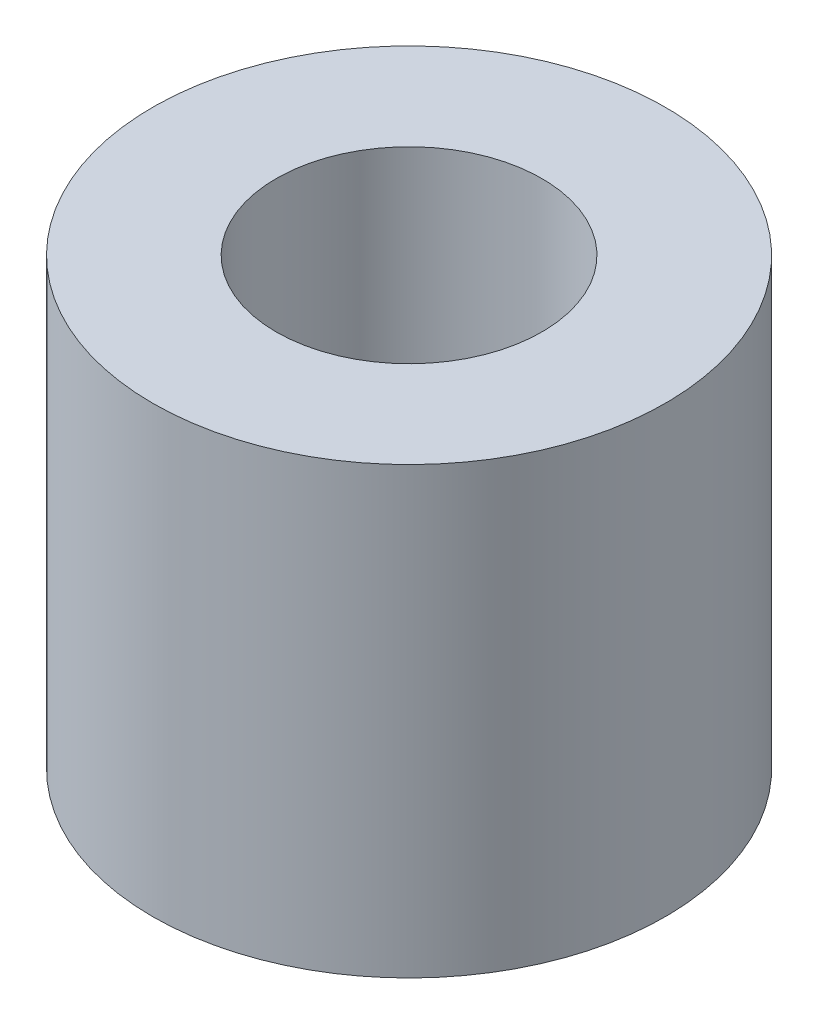
ISO-10303-21;
HEADER;
FILE_DESCRIPTION(('STEP AP214'),'2;1');
FILE_NAME('part.step','',(''),(''),'','','');
FILE_SCHEMA(('AUTOMOTIVE_DESIGN { 1 0 10303 214 1 1 1 1 }'));
ENDSEC;
DATA;
#1=APPLICATION_CONTEXT('core data for automotive mechanical design processes');
#2=APPLICATION_PROTOCOL_DEFINITION('international standard','automotive_design',2000,#1);
#3=PRODUCT_CONTEXT('',#1,'mechanical');
#4=PRODUCT('Part','Part','',(#3));
#5=PRODUCT_RELATED_PRODUCT_CATEGORY('part','',(#4));
#6=PRODUCT_DEFINITION_FORMATION('','',#4);
#7=PRODUCT_DEFINITION_CONTEXT('part definition',#1,'design');
#8=PRODUCT_DEFINITION('design','',#6,#7);
#9=PRODUCT_DEFINITION_SHAPE('','',#8);
#10=(LENGTH_UNIT() NAMED_UNIT(*) SI_UNIT(.MILLI.,.METRE.));
#11=(NAMED_UNIT(*) PLANE_ANGLE_UNIT() SI_UNIT($,.RADIAN.));
#12=(NAMED_UNIT(*) SI_UNIT($,.STERADIAN.) SOLID_ANGLE_UNIT());
#13=UNCERTAINTY_MEASURE_WITH_UNIT(LENGTH_MEASURE(1.E-05),#10,'distance_accuracy_value','');
#14=(GEOMETRIC_REPRESENTATION_CONTEXT(3) GLOBAL_UNCERTAINTY_ASSIGNED_CONTEXT((#13)) GLOBAL_UNIT_ASSIGNED_CONTEXT((#10,
#11,#12)) REPRESENTATION_CONTEXT('',''));
#15=CARTESIAN_POINT('',(0.,0.,0.));
#16=DIRECTION('',(0.,0.,1.));
#17=DIRECTION('',(1.,0.,0.));
#18=AXIS2_PLACEMENT_3D('',#15,#16,#17);
#19=CARTESIAN_POINT('',(0.,6.8834,0.));
#20=DIRECTION('',(0.,1.,0.));
#21=DIRECTION('',(0.,0.,1.));
#22=AXIS2_PLACEMENT_3D('',#19,#20,#21);
#23=PLANE('',#22);
#24=CARTESIAN_POINT('',(0.,6.8834,0.));
#25=DIRECTION('',(0.,1.,0.));
#26=DIRECTION('',(0.,0.,1.));
#27=AXIS2_PLACEMENT_3D('',#24,#25,#26);
#28=CIRCLE('',#27,3.96875);
#29=CARTESIAN_POINT('',(0.,6.8834,3.96875));
#30=VERTEX_POINT('',#29);
#31=EDGE_CURVE('E10',#30,#30,#28,.T.);
#32=ORIENTED_EDGE('',*,*,#31,.T.);
#33=EDGE_LOOP('',(#32));
#34=FACE_BOUND('',#33,.T.);
#35=CARTESIAN_POINT('',(0.,6.8834,0.));
#36=DIRECTION('',(0.,1.,0.));
#37=DIRECTION('',(0.,0.,1.));
#38=AXIS2_PLACEMENT_3D('',#35,#36,#37);
#39=CIRCLE('',#38,2.0574);
#40=CARTESIAN_POINT('',(0.,6.8834,2.0574));
#41=VERTEX_POINT('',#40);
#42=EDGE_CURVE('E46',#41,#41,#39,.T.);
#43=ORIENTED_EDGE('',*,*,#42,.F.);
#44=EDGE_LOOP('',(#43));
#45=FACE_BOUND('',#44,.T.);
#46=ADVANCED_FACE('F35',(#34,#45),#23,.T.);
#47=CARTESIAN_POINT('',(0.,0.,0.));
#48=DIRECTION('',(0.,1.,0.));
#49=DIRECTION('',(0.,0.,1.));
#50=AXIS2_PLACEMENT_3D('',#47,#48,#49);
#51=PLANE('',#50);
#52=CARTESIAN_POINT('',(0.,0.,0.));
#53=DIRECTION('',(0.,1.,0.));
#54=DIRECTION('',(0.,0.,1.));
#55=AXIS2_PLACEMENT_3D('',#52,#53,#54);
#56=CIRCLE('',#55,3.96875);
#57=CARTESIAN_POINT('',(0.,0.,3.96875));
#58=VERTEX_POINT('',#57);
#59=EDGE_CURVE('E39',#58,#58,#56,.T.);
#60=ORIENTED_EDGE('',*,*,#59,.F.);
#61=EDGE_LOOP('',(#60));
#62=FACE_BOUND('',#61,.T.);
#63=CARTESIAN_POINT('',(0.,0.,0.));
#64=DIRECTION('',(0.,1.,0.));
#65=DIRECTION('',(0.,0.,1.));
#66=AXIS2_PLACEMENT_3D('',#63,#64,#65);
#67=CIRCLE('',#66,2.0574);
#68=CARTESIAN_POINT('',(0.,0.,2.0574));
#69=VERTEX_POINT('',#68);
#70=EDGE_CURVE('E48',#69,#69,#67,.T.);
#71=ORIENTED_EDGE('',*,*,#70,.T.);
#72=EDGE_LOOP('',(#71));
#73=FACE_BOUND('',#72,.T.);
#74=ADVANCED_FACE('F58',(#62,#73),#51,.F.);
#75=CARTESIAN_POINT('',(0.,6.8834,0.));
#76=DIRECTION('',(0.,-1.,0.));
#77=DIRECTION('',(0.,0.,-1.));
#78=AXIS2_PLACEMENT_3D('',#75,#76,#77);
#79=CYLINDRICAL_SURFACE('',#78,3.96875);
#80=ORIENTED_EDGE('',*,*,#31,.F.);
#81=EDGE_LOOP('',(#80));
#82=FACE_BOUND('',#81,.T.);
#83=ORIENTED_EDGE('',*,*,#59,.T.);
#84=EDGE_LOOP('',(#83));
#85=FACE_BOUND('',#84,.T.);
#86=ADVANCED_FACE('F37',(#82,#85),#79,.T.);
#87=CARTESIAN_POINT('',(0.,6.8834,0.));
#88=DIRECTION('',(0.,-1.,0.));
#89=DIRECTION('',(0.,0.,-1.));
#90=AXIS2_PLACEMENT_3D('',#87,#88,#89);
#91=CYLINDRICAL_SURFACE('',#90,2.0574);
#92=ORIENTED_EDGE('',*,*,#42,.T.);
#93=EDGE_LOOP('',(#92));
#94=FACE_BOUND('',#93,.T.);
#95=ORIENTED_EDGE('',*,*,#70,.F.);
#96=EDGE_LOOP('',(#95));
#97=FACE_BOUND('',#96,.T.);
#98=ADVANCED_FACE('F54',(#94,#97),#91,.F.);
#99=CLOSED_SHELL('',(#46,#74,#86,#98));
#100=MANIFOLD_SOLID_BREP('B2',#99);
#101=ADVANCED_BREP_SHAPE_REPRESENTATION('',(#18,#100),#14);
#102=SHAPE_DEFINITION_REPRESENTATION(#9,#101);
ENDSEC;
END-ISO-10303-21;
